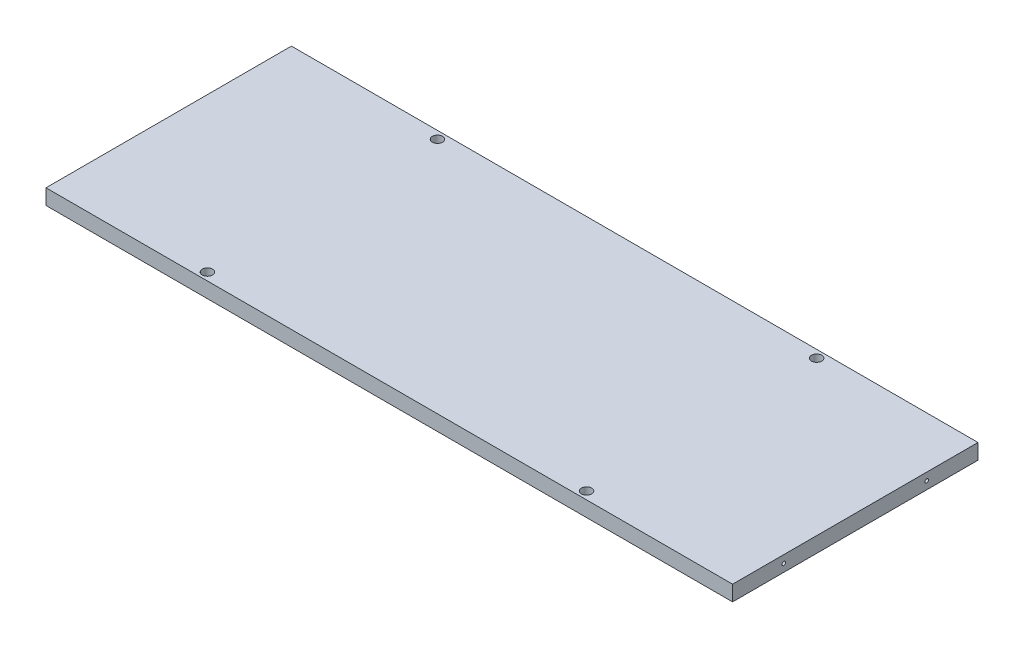
ISO-10303-21;
HEADER;
FILE_DESCRIPTION(('STEP AP214'),'2;1');
FILE_NAME('part.step','',(''),(''),'','','');
FILE_SCHEMA(('AUTOMOTIVE_DESIGN { 1 0 10303 214 1 1 1 1 }'));
ENDSEC;
DATA;
#1=APPLICATION_CONTEXT('core data for automotive mechanical design processes');
#2=APPLICATION_PROTOCOL_DEFINITION('international standard','automotive_design',2000,#1);
#3=PRODUCT_CONTEXT('',#1,'mechanical');
#4=PRODUCT('Part','Part','',(#3));
#5=PRODUCT_RELATED_PRODUCT_CATEGORY('part','',(#4));
#6=PRODUCT_DEFINITION_FORMATION('','',#4);
#7=PRODUCT_DEFINITION_CONTEXT('part definition',#1,'design');
#8=PRODUCT_DEFINITION('design','',#6,#7);
#9=PRODUCT_DEFINITION_SHAPE('','',#8);
#10=(LENGTH_UNIT() NAMED_UNIT(*) SI_UNIT(.MILLI.,.METRE.));
#11=(NAMED_UNIT(*) PLANE_ANGLE_UNIT() SI_UNIT($,.RADIAN.));
#12=(NAMED_UNIT(*) SI_UNIT($,.STERADIAN.) SOLID_ANGLE_UNIT());
#13=UNCERTAINTY_MEASURE_WITH_UNIT(LENGTH_MEASURE(1.E-05),#10,'distance_accuracy_value','');
#14=(GEOMETRIC_REPRESENTATION_CONTEXT(3) GLOBAL_UNCERTAINTY_ASSIGNED_CONTEXT((#13)) GLOBAL_UNIT_ASSIGNED_CONTEXT((#10,
#11,#12)) REPRESENTATION_CONTEXT('',''));
#15=CARTESIAN_POINT('',(0.,0.,0.));
#16=DIRECTION('',(0.,0.,1.));
#17=DIRECTION('',(1.,0.,0.));
#18=AXIS2_PLACEMENT_3D('',#15,#16,#17);
#19=CARTESIAN_POINT('',(37.,-1.50000000000001,46.4));
#20=DIRECTION('',(0.,1.,0.));
#21=DIRECTION('',(0.,0.,1.));
#22=AXIS2_PLACEMENT_3D('',#19,#20,#21);
#23=CYLINDRICAL_SURFACE('',#22,0.700000000000001);
#24=CARTESIAN_POINT('',(37.,-1.50000000000001,46.4));
#25=DIRECTION('',(0.,1.,0.));
#26=DIRECTION('',(0.,0.,1.));
#27=AXIS2_PLACEMENT_3D('',#24,#25,#26);
#28=CIRCLE('',#27,0.700000000000001);
#29=CARTESIAN_POINT('',(37.,-1.50000000000001,47.1));
#30=VERTEX_POINT('',#29);
#31=EDGE_CURVE('E109',#30,#30,#28,.T.);
#32=CARTESIAN_POINT('',(37.,0.,46.4));
#33=DIRECTION('',(0.,1.,0.));
#34=DIRECTION('',(0.,0.,1.));
#35=AXIS2_PLACEMENT_3D('',#32,#33,#34);
#36=CIRCLE('',#35,0.700000000000001);
#37=CARTESIAN_POINT('',(37.,0.,47.1));
#38=VERTEX_POINT('',#37);
#39=EDGE_CURVE('E43',#38,#38,#36,.F.);
#40=CARTESIAN_POINT('',(37.,-1.50000000000001,47.1));
#41=CARTESIAN_POINT('',(37.,-1.48437500000001,47.1));
#42=CARTESIAN_POINT('',(37.,-1.46875000000001,47.1));
#43=CARTESIAN_POINT('',(37.,-1.43750000000001,47.1));
#44=CARTESIAN_POINT('',(37.,-1.42187500000001,47.1));
#45=CARTESIAN_POINT('',(37.,-1.39062500000001,47.1));
#46=CARTESIAN_POINT('',(37.,-1.37500000000001,47.1));
#47=CARTESIAN_POINT('',(37.,-1.34375000000001,47.1));
#48=CARTESIAN_POINT('',(37.,-1.32812500000001,47.1));
#49=CARTESIAN_POINT('',(37.,-1.29687500000001,47.1));
#50=CARTESIAN_POINT('',(37.,-1.28125000000001,47.1));
#51=CARTESIAN_POINT('',(37.,-1.25000000000001,47.1));
#52=CARTESIAN_POINT('',(37.,-1.23437500000001,47.1));
#53=CARTESIAN_POINT('',(37.,-1.20312500000001,47.1));
#54=CARTESIAN_POINT('',(37.,-1.18750000000001,47.1));
#55=CARTESIAN_POINT('',(37.,-1.15625000000001,47.1));
#56=CARTESIAN_POINT('',(37.,-1.14062500000001,47.1));
#57=CARTESIAN_POINT('',(37.,-1.10937500000001,47.1));
#58=CARTESIAN_POINT('',(37.,-1.09375000000001,47.1));
#59=CARTESIAN_POINT('',(37.,-1.06250000000001,47.1));
#60=CARTESIAN_POINT('',(37.,-1.04687500000001,47.1));
#61=CARTESIAN_POINT('',(37.,-1.01562500000001,47.1));
#62=CARTESIAN_POINT('',(37.,-1.00000000000001,47.1));
#63=CARTESIAN_POINT('',(37.,-0.968750000000004,47.1));
#64=CARTESIAN_POINT('',(37.,-0.953125000000004,47.1));
#65=CARTESIAN_POINT('',(37.,-0.921875000000004,47.1));
#66=CARTESIAN_POINT('',(37.,-0.906250000000003,47.1));
#67=CARTESIAN_POINT('',(37.,-0.875000000000003,47.1));
#68=CARTESIAN_POINT('',(37.,-0.859375000000002,47.1));
#69=CARTESIAN_POINT('',(37.,-0.828125000000002,47.1));
#70=CARTESIAN_POINT('',(37.,-0.812500000000001,47.1));
#71=CARTESIAN_POINT('',(37.,-0.781250000000001,47.1));
#72=CARTESIAN_POINT('',(37.,-0.765625000000001,47.1));
#73=CARTESIAN_POINT('',(37.,-0.734375,47.1));
#74=CARTESIAN_POINT('',(37.,-0.71875,47.1));
#75=CARTESIAN_POINT('',(37.,-0.687499999999999,47.1));
#76=CARTESIAN_POINT('',(37.,-0.671874999999999,47.1));
#77=CARTESIAN_POINT('',(37.,-0.640624999999998,47.1));
#78=CARTESIAN_POINT('',(37.,-0.624999999999998,47.1));
#79=CARTESIAN_POINT('',(37.,-0.593749999999997,47.1));
#80=CARTESIAN_POINT('',(37.,-0.578124999999997,47.1));
#81=CARTESIAN_POINT('',(37.,-0.546874999999996,47.1));
#82=CARTESIAN_POINT('',(37.,-0.531249999999996,47.1));
#83=CARTESIAN_POINT('',(37.,-0.499999999999995,47.1));
#84=CARTESIAN_POINT('',(37.,-0.484374999999995,47.1));
#85=CARTESIAN_POINT('',(37.,-0.453124999999995,47.1));
#86=CARTESIAN_POINT('',(37.,-0.437499999999994,47.1));
#87=CARTESIAN_POINT('',(37.,-0.406249999999994,47.1));
#88=CARTESIAN_POINT('',(37.,-0.390624999999993,47.1));
#89=CARTESIAN_POINT('',(37.,-0.359374999999993,47.1));
#90=CARTESIAN_POINT('',(37.,-0.343749999999992,47.1));
#91=CARTESIAN_POINT('',(37.,-0.312499999999992,47.1));
#92=CARTESIAN_POINT('',(37.,-0.296874999999991,47.1));
#93=CARTESIAN_POINT('',(37.,-0.265624999999991,47.1));
#94=CARTESIAN_POINT('',(37.,-0.249999999999991,47.1));
#95=CARTESIAN_POINT('',(37.,-0.21874999999999,47.1));
#96=CARTESIAN_POINT('',(37.,-0.20312499999999,47.1));
#97=CARTESIAN_POINT('',(37.,-0.171874999999989,47.1));
#98=CARTESIAN_POINT('',(37.,-0.156249999999989,47.1));
#99=CARTESIAN_POINT('',(37.,-0.124999999999988,47.1));
#100=CARTESIAN_POINT('',(37.,-0.109374999999988,47.1));
#101=CARTESIAN_POINT('',(37.,-0.0781249999999872,47.1));
#102=CARTESIAN_POINT('',(37.,-0.0624999999999869,47.1));
#103=CARTESIAN_POINT('',(37.,-0.0312499999999863,47.1));
#104=CARTESIAN_POINT('',(37.,-0.015624999999986,47.1));
#105=CARTESIAN_POINT('',(37.,0.,47.1));
#106=B_SPLINE_CURVE_WITH_KNOTS('',3,(#40,#41,#42,#43,#44,#45,#46,#47,#48,#49,#50,#51,#52,#53,
#54,#55,#56,#57,#58,#59,#60,#61,#62,#63,#64,#65,#66,#67,#68,#69,#70,#71,#72,#73,#74,#75,#76,#77,
#78,#79,#80,#81,#82,#83,#84,#85,#86,#87,#88,#89,#90,#91,#92,#93,#94,#95,#96,#97,#98,#99,#100,
#101,#102,#103,#104,#105),.UNSPECIFIED.,.F.,.F.,(4,2,2,2,2,2,2,2,2,2,2,2,2,2,2,2,2,2,2,2,2,2,2,
2,2,2,2,2,2,2,2,2,4),(0.,0.0468750000000007,0.0937500000000016,0.140625000000002,
0.187500000000003,0.234375000000004,0.281250000000005,0.328125000000006,0.375000000000007,
0.421875000000008,0.468750000000009,0.51562500000001,0.562500000000011,0.609375000000012,
0.656250000000013,0.703125000000013,0.750000000000014,0.796875000000015,0.843750000000016,
0.890625000000017,0.937500000000018,0.984375000000019,1.03125000000002,1.07812500000002,
1.12500000000002,1.17187500000002,1.21875000000002,1.26562500000002,1.31250000000003,
1.35937500000003,1.40625000000003,1.45312500000003,1.50000000000003),.UNSPECIFIED.);
#107=EDGE_CURVE('BSEAM39',#30,#38,#106,.T.);
#108=ORIENTED_EDGE('',*,*,#31,.F.);
#109=ORIENTED_EDGE('',*,*,#39,.F.);
#110=ORIENTED_EDGE('',*,*,#107,.T.);
#111=ORIENTED_EDGE('',*,*,#107,.F.);
#112=EDGE_LOOP('',(#108,#110,#109,#111));
#113=FACE_BOUND('',#112,.T.);
#114=ADVANCED_FACE('F39',(#113),#23,.F.);
#115=CARTESIAN_POINT('',(-37.,-1.50000000000001,46.4));
#116=DIRECTION('',(0.,1.,0.));
#117=DIRECTION('',(0.,0.,1.));
#118=AXIS2_PLACEMENT_3D('',#115,#116,#117);
#119=CYLINDRICAL_SURFACE('',#118,0.700000000000001);
#120=CARTESIAN_POINT('',(-37.,-1.50000000000001,46.4));
#121=DIRECTION('',(0.,1.,0.));
#122=DIRECTION('',(0.,0.,1.));
#123=AXIS2_PLACEMENT_3D('',#120,#121,#122);
#124=CIRCLE('',#123,0.700000000000001);
#125=CARTESIAN_POINT('',(-37.,-1.50000000000001,47.1));
#126=VERTEX_POINT('',#125);
#127=EDGE_CURVE('E135',#126,#126,#124,.T.);
#128=CARTESIAN_POINT('',(-37.,0.,46.4));
#129=DIRECTION('',(0.,1.,0.));
#130=DIRECTION('',(0.,0.,1.));
#131=AXIS2_PLACEMENT_3D('',#128,#129,#130);
#132=CIRCLE('',#131,0.700000000000001);
#133=CARTESIAN_POINT('',(-37.,0.,47.1));
#134=VERTEX_POINT('',#133);
#135=EDGE_CURVE('E121',#134,#134,#132,.F.);
#136=CARTESIAN_POINT('',(-37.,-1.50000000000001,47.1));
#137=CARTESIAN_POINT('',(-37.,-1.48437500000001,47.1));
#138=CARTESIAN_POINT('',(-37.,-1.46875000000001,47.1));
#139=CARTESIAN_POINT('',(-37.,-1.43750000000001,47.1));
#140=CARTESIAN_POINT('',(-37.,-1.42187500000001,47.1));
#141=CARTESIAN_POINT('',(-37.,-1.39062500000001,47.1));
#142=CARTESIAN_POINT('',(-37.,-1.37500000000001,47.1));
#143=CARTESIAN_POINT('',(-37.,-1.34375000000001,47.1));
#144=CARTESIAN_POINT('',(-37.,-1.32812500000001,47.1));
#145=CARTESIAN_POINT('',(-37.,-1.29687500000001,47.1));
#146=CARTESIAN_POINT('',(-37.,-1.28125000000001,47.1));
#147=CARTESIAN_POINT('',(-37.,-1.25000000000001,47.1));
#148=CARTESIAN_POINT('',(-37.,-1.23437500000001,47.1));
#149=CARTESIAN_POINT('',(-37.,-1.20312500000001,47.1));
#150=CARTESIAN_POINT('',(-37.,-1.18750000000001,47.1));
#151=CARTESIAN_POINT('',(-37.,-1.15625000000001,47.1));
#152=CARTESIAN_POINT('',(-37.,-1.14062500000001,47.1));
#153=CARTESIAN_POINT('',(-37.,-1.10937500000001,47.1));
#154=CARTESIAN_POINT('',(-37.,-1.09375000000001,47.1));
#155=CARTESIAN_POINT('',(-37.,-1.06250000000001,47.1));
#156=CARTESIAN_POINT('',(-37.,-1.04687500000001,47.1));
#157=CARTESIAN_POINT('',(-37.,-1.01562500000001,47.1));
#158=CARTESIAN_POINT('',(-37.,-1.00000000000001,47.1));
#159=CARTESIAN_POINT('',(-37.,-0.968750000000004,47.1));
#160=CARTESIAN_POINT('',(-37.,-0.953125000000004,47.1));
#161=CARTESIAN_POINT('',(-37.,-0.921875000000004,47.1));
#162=CARTESIAN_POINT('',(-37.,-0.906250000000003,47.1));
#163=CARTESIAN_POINT('',(-37.,-0.875000000000003,47.1));
#164=CARTESIAN_POINT('',(-37.,-0.859375000000002,47.1));
#165=CARTESIAN_POINT('',(-37.,-0.828125000000002,47.1));
#166=CARTESIAN_POINT('',(-37.,-0.812500000000001,47.1));
#167=CARTESIAN_POINT('',(-37.,-0.781250000000001,47.1));
#168=CARTESIAN_POINT('',(-37.,-0.765625000000001,47.1));
#169=CARTESIAN_POINT('',(-37.,-0.734375,47.1));
#170=CARTESIAN_POINT('',(-37.,-0.71875,47.1));
#171=CARTESIAN_POINT('',(-37.,-0.687499999999999,47.1));
#172=CARTESIAN_POINT('',(-37.,-0.671874999999999,47.1));
#173=CARTESIAN_POINT('',(-37.,-0.640624999999998,47.1));
#174=CARTESIAN_POINT('',(-37.,-0.624999999999998,47.1));
#175=CARTESIAN_POINT('',(-37.,-0.593749999999997,47.1));
#176=CARTESIAN_POINT('',(-37.,-0.578124999999997,47.1));
#177=CARTESIAN_POINT('',(-37.,-0.546874999999996,47.1));
#178=CARTESIAN_POINT('',(-37.,-0.531249999999996,47.1));
#179=CARTESIAN_POINT('',(-37.,-0.499999999999995,47.1));
#180=CARTESIAN_POINT('',(-37.,-0.484374999999995,47.1));
#181=CARTESIAN_POINT('',(-37.,-0.453124999999995,47.1));
#182=CARTESIAN_POINT('',(-37.,-0.437499999999994,47.1));
#183=CARTESIAN_POINT('',(-37.,-0.406249999999994,47.1));
#184=CARTESIAN_POINT('',(-37.,-0.390624999999993,47.1));
#185=CARTESIAN_POINT('',(-37.,-0.359374999999993,47.1));
#186=CARTESIAN_POINT('',(-37.,-0.343749999999992,47.1));
#187=CARTESIAN_POINT('',(-37.,-0.312499999999992,47.1));
#188=CARTESIAN_POINT('',(-37.,-0.296874999999991,47.1));
#189=CARTESIAN_POINT('',(-37.,-0.265624999999991,47.1));
#190=CARTESIAN_POINT('',(-37.,-0.249999999999991,47.1));
#191=CARTESIAN_POINT('',(-37.,-0.21874999999999,47.1));
#192=CARTESIAN_POINT('',(-37.,-0.20312499999999,47.1));
#193=CARTESIAN_POINT('',(-37.,-0.171874999999989,47.1));
#194=CARTESIAN_POINT('',(-37.,-0.156249999999989,47.1));
#195=CARTESIAN_POINT('',(-37.,-0.124999999999988,47.1));
#196=CARTESIAN_POINT('',(-37.,-0.109374999999988,47.1));
#197=CARTESIAN_POINT('',(-37.,-0.0781249999999872,47.1));
#198=CARTESIAN_POINT('',(-37.,-0.0624999999999869,47.1));
#199=CARTESIAN_POINT('',(-37.,-0.0312499999999863,47.1));
#200=CARTESIAN_POINT('',(-37.,-0.015624999999986,47.1));
#201=CARTESIAN_POINT('',(-37.,0.,47.1));
#202=B_SPLINE_CURVE_WITH_KNOTS('',3,(#136,#137,#138,#139,#140,#141,#142,#143,#144,#145,#146,
#147,#148,#149,#150,#151,#152,#153,#154,#155,#156,#157,#158,#159,#160,#161,#162,#163,#164,#165,
#166,#167,#168,#169,#170,#171,#172,#173,#174,#175,#176,#177,#178,#179,#180,#181,#182,#183,#184,
#185,#186,#187,#188,#189,#190,#191,#192,#193,#194,#195,#196,#197,#198,#199,#200,#201),
.UNSPECIFIED.,.F.,.F.,(4,2,2,2,2,2,2,2,2,2,2,2,2,2,2,2,2,2,2,2,2,2,2,2,2,2,2,2,2,2,2,2,4),(0.,
0.0468750000000007,0.0937500000000016,0.140625000000002,0.187500000000003,0.234375000000004,
0.281250000000005,0.328125000000006,0.375000000000007,0.421875000000008,0.468750000000009,
0.51562500000001,0.562500000000011,0.609375000000012,0.656250000000013,0.703125000000013,
0.750000000000014,0.796875000000015,0.843750000000016,0.890625000000017,0.937500000000018,
0.984375000000019,1.03125000000002,1.07812500000002,1.12500000000002,1.17187500000002,
1.21875000000002,1.26562500000002,1.31250000000003,1.35937500000003,1.40625000000003,
1.45312500000003,1.50000000000003),.UNSPECIFIED.);
#203=EDGE_CURVE('BSEAM218',#126,#134,#202,.T.);
#204=ORIENTED_EDGE('',*,*,#127,.F.);
#205=ORIENTED_EDGE('',*,*,#135,.F.);
#206=ORIENTED_EDGE('',*,*,#203,.T.);
#207=ORIENTED_EDGE('',*,*,#203,.F.);
#208=EDGE_LOOP('',(#204,#206,#205,#207));
#209=FACE_BOUND('',#208,.T.);
#210=ADVANCED_FACE('F218',(#209),#119,.F.);
#211=CARTESIAN_POINT('',(-37.,-1.50000000000001,1.5));
#212=DIRECTION('',(0.,1.,0.));
#213=DIRECTION('',(0.,0.,1.));
#214=AXIS2_PLACEMENT_3D('',#211,#212,#213);
#215=CYLINDRICAL_SURFACE('',#214,0.700000000000001);
#216=CARTESIAN_POINT('',(-37.,-1.50000000000001,1.5));
#217=DIRECTION('',(0.,1.,0.));
#218=DIRECTION('',(0.,0.,1.));
#219=AXIS2_PLACEMENT_3D('',#216,#217,#218);
#220=CIRCLE('',#219,0.700000000000001);
#221=CARTESIAN_POINT('',(-37.,-1.50000000000001,2.2));
#222=VERTEX_POINT('',#221);
#223=EDGE_CURVE('E130',#222,#222,#220,.T.);
#224=CARTESIAN_POINT('',(-37.,0.,1.5));
#225=DIRECTION('',(0.,1.,0.));
#226=DIRECTION('',(0.,0.,1.));
#227=AXIS2_PLACEMENT_3D('',#224,#225,#226);
#228=CIRCLE('',#227,0.700000000000001);
#229=CARTESIAN_POINT('',(-37.,0.,2.2));
#230=VERTEX_POINT('',#229);
#231=EDGE_CURVE('E118',#230,#230,#228,.F.);
#232=CARTESIAN_POINT('',(-37.,-1.50000000000001,2.2));
#233=CARTESIAN_POINT('',(-37.,-1.48437500000001,2.2));
#234=CARTESIAN_POINT('',(-37.,-1.46875000000001,2.2));
#235=CARTESIAN_POINT('',(-37.,-1.43750000000001,2.2));
#236=CARTESIAN_POINT('',(-37.,-1.42187500000001,2.2));
#237=CARTESIAN_POINT('',(-37.,-1.39062500000001,2.2));
#238=CARTESIAN_POINT('',(-37.,-1.37500000000001,2.2));
#239=CARTESIAN_POINT('',(-37.,-1.34375000000001,2.2));
#240=CARTESIAN_POINT('',(-37.,-1.32812500000001,2.2));
#241=CARTESIAN_POINT('',(-37.,-1.29687500000001,2.2));
#242=CARTESIAN_POINT('',(-37.,-1.28125000000001,2.2));
#243=CARTESIAN_POINT('',(-37.,-1.25000000000001,2.2));
#244=CARTESIAN_POINT('',(-37.,-1.23437500000001,2.2));
#245=CARTESIAN_POINT('',(-37.,-1.20312500000001,2.2));
#246=CARTESIAN_POINT('',(-37.,-1.18750000000001,2.2));
#247=CARTESIAN_POINT('',(-37.,-1.15625000000001,2.2));
#248=CARTESIAN_POINT('',(-37.,-1.14062500000001,2.2));
#249=CARTESIAN_POINT('',(-37.,-1.10937500000001,2.2));
#250=CARTESIAN_POINT('',(-37.,-1.09375000000001,2.2));
#251=CARTESIAN_POINT('',(-37.,-1.06250000000001,2.2));
#252=CARTESIAN_POINT('',(-37.,-1.04687500000001,2.2));
#253=CARTESIAN_POINT('',(-37.,-1.01562500000001,2.2));
#254=CARTESIAN_POINT('',(-37.,-1.00000000000001,2.2));
#255=CARTESIAN_POINT('',(-37.,-0.968750000000004,2.2));
#256=CARTESIAN_POINT('',(-37.,-0.953125000000004,2.2));
#257=CARTESIAN_POINT('',(-37.,-0.921875000000004,2.2));
#258=CARTESIAN_POINT('',(-37.,-0.906250000000003,2.2));
#259=CARTESIAN_POINT('',(-37.,-0.875000000000003,2.2));
#260=CARTESIAN_POINT('',(-37.,-0.859375000000002,2.2));
#261=CARTESIAN_POINT('',(-37.,-0.828125000000002,2.2));
#262=CARTESIAN_POINT('',(-37.,-0.812500000000001,2.2));
#263=CARTESIAN_POINT('',(-37.,-0.781250000000001,2.2));
#264=CARTESIAN_POINT('',(-37.,-0.765625000000001,2.2));
#265=CARTESIAN_POINT('',(-37.,-0.734375,2.2));
#266=CARTESIAN_POINT('',(-37.,-0.71875,2.2));
#267=CARTESIAN_POINT('',(-37.,-0.687499999999999,2.2));
#268=CARTESIAN_POINT('',(-37.,-0.671874999999999,2.2));
#269=CARTESIAN_POINT('',(-37.,-0.640624999999998,2.2));
#270=CARTESIAN_POINT('',(-37.,-0.624999999999998,2.2));
#271=CARTESIAN_POINT('',(-37.,-0.593749999999997,2.2));
#272=CARTESIAN_POINT('',(-37.,-0.578124999999997,2.2));
#273=CARTESIAN_POINT('',(-37.,-0.546874999999996,2.2));
#274=CARTESIAN_POINT('',(-37.,-0.531249999999996,2.2));
#275=CARTESIAN_POINT('',(-37.,-0.499999999999995,2.2));
#276=CARTESIAN_POINT('',(-37.,-0.484374999999995,2.2));
#277=CARTESIAN_POINT('',(-37.,-0.453124999999995,2.2));
#278=CARTESIAN_POINT('',(-37.,-0.437499999999994,2.2));
#279=CARTESIAN_POINT('',(-37.,-0.406249999999994,2.2));
#280=CARTESIAN_POINT('',(-37.,-0.390624999999993,2.2));
#281=CARTESIAN_POINT('',(-37.,-0.359374999999993,2.2));
#282=CARTESIAN_POINT('',(-37.,-0.343749999999992,2.2));
#283=CARTESIAN_POINT('',(-37.,-0.312499999999992,2.2));
#284=CARTESIAN_POINT('',(-37.,-0.296874999999991,2.2));
#285=CARTESIAN_POINT('',(-37.,-0.265624999999991,2.2));
#286=CARTESIAN_POINT('',(-37.,-0.249999999999991,2.2));
#287=CARTESIAN_POINT('',(-37.,-0.21874999999999,2.2));
#288=CARTESIAN_POINT('',(-37.,-0.20312499999999,2.2));
#289=CARTESIAN_POINT('',(-37.,-0.171874999999989,2.2));
#290=CARTESIAN_POINT('',(-37.,-0.156249999999989,2.2));
#291=CARTESIAN_POINT('',(-37.,-0.124999999999988,2.2));
#292=CARTESIAN_POINT('',(-37.,-0.109374999999988,2.2));
#293=CARTESIAN_POINT('',(-37.,-0.0781249999999872,2.2));
#294=CARTESIAN_POINT('',(-37.,-0.0624999999999869,2.2));
#295=CARTESIAN_POINT('',(-37.,-0.0312499999999863,2.2));
#296=CARTESIAN_POINT('',(-37.,-0.015624999999986,2.2));
#297=CARTESIAN_POINT('',(-37.,0.,2.2));
#298=B_SPLINE_CURVE_WITH_KNOTS('',3,(#232,#233,#234,#235,#236,#237,#238,#239,#240,#241,#242,
#243,#244,#245,#246,#247,#248,#249,#250,#251,#252,#253,#254,#255,#256,#257,#258,#259,#260,#261,
#262,#263,#264,#265,#266,#267,#268,#269,#270,#271,#272,#273,#274,#275,#276,#277,#278,#279,#280,
#281,#282,#283,#284,#285,#286,#287,#288,#289,#290,#291,#292,#293,#294,#295,#296,#297),
.UNSPECIFIED.,.F.,.F.,(4,2,2,2,2,2,2,2,2,2,2,2,2,2,2,2,2,2,2,2,2,2,2,2,2,2,2,2,2,2,2,2,4),(0.,
0.0468750000000007,0.0937500000000016,0.140625000000002,0.187500000000003,0.234375000000004,
0.281250000000005,0.328125000000006,0.375000000000007,0.421875000000008,0.468750000000009,
0.51562500000001,0.562500000000011,0.609375000000012,0.656250000000013,0.703125000000013,
0.750000000000014,0.796875000000015,0.843750000000016,0.890625000000017,0.937500000000018,
0.984375000000019,1.03125000000002,1.07812500000002,1.12500000000002,1.17187500000002,
1.21875000000002,1.26562500000002,1.31250000000003,1.35937500000003,1.40625000000003,
1.45312500000003,1.50000000000003),.UNSPECIFIED.);
#299=EDGE_CURVE('BSEAM224',#222,#230,#298,.T.);
#300=ORIENTED_EDGE('',*,*,#223,.F.);
#301=ORIENTED_EDGE('',*,*,#231,.F.);
#302=ORIENTED_EDGE('',*,*,#299,.T.);
#303=ORIENTED_EDGE('',*,*,#299,.F.);
#304=EDGE_LOOP('',(#300,#302,#301,#303));
#305=FACE_BOUND('',#304,.T.);
#306=ADVANCED_FACE('F224',(#305),#215,.F.);
#307=CARTESIAN_POINT('',(37.,-1.50000000000001,1.5));
#308=DIRECTION('',(0.,1.,0.));
#309=DIRECTION('',(0.,0.,1.));
#310=AXIS2_PLACEMENT_3D('',#307,#308,#309);
#311=CYLINDRICAL_SURFACE('',#310,0.700000000000001);
#312=CARTESIAN_POINT('',(37.,-1.50000000000001,1.5));
#313=DIRECTION('',(0.,1.,0.));
#314=DIRECTION('',(0.,0.,1.));
#315=AXIS2_PLACEMENT_3D('',#312,#313,#314);
#316=CIRCLE('',#315,0.700000000000001);
#317=CARTESIAN_POINT('',(37.,-1.50000000000001,2.2));
#318=VERTEX_POINT('',#317);
#319=EDGE_CURVE('E126',#318,#318,#316,.T.);
#320=CARTESIAN_POINT('',(37.,0.,1.5));
#321=DIRECTION('',(0.,1.,0.));
#322=DIRECTION('',(0.,0.,1.));
#323=AXIS2_PLACEMENT_3D('',#320,#321,#322);
#324=CIRCLE('',#323,0.700000000000001);
#325=CARTESIAN_POINT('',(37.,0.,2.2));
#326=VERTEX_POINT('',#325);
#327=EDGE_CURVE('E115',#326,#326,#324,.F.);
#328=CARTESIAN_POINT('',(37.,-1.50000000000001,2.2));
#329=CARTESIAN_POINT('',(37.,-1.48437500000001,2.2));
#330=CARTESIAN_POINT('',(37.,-1.46875000000001,2.2));
#331=CARTESIAN_POINT('',(37.,-1.43750000000001,2.2));
#332=CARTESIAN_POINT('',(37.,-1.42187500000001,2.2));
#333=CARTESIAN_POINT('',(37.,-1.39062500000001,2.2));
#334=CARTESIAN_POINT('',(37.,-1.37500000000001,2.2));
#335=CARTESIAN_POINT('',(37.,-1.34375000000001,2.2));
#336=CARTESIAN_POINT('',(37.,-1.32812500000001,2.2));
#337=CARTESIAN_POINT('',(37.,-1.29687500000001,2.2));
#338=CARTESIAN_POINT('',(37.,-1.28125000000001,2.2));
#339=CARTESIAN_POINT('',(37.,-1.25000000000001,2.2));
#340=CARTESIAN_POINT('',(37.,-1.23437500000001,2.2));
#341=CARTESIAN_POINT('',(37.,-1.20312500000001,2.2));
#342=CARTESIAN_POINT('',(37.,-1.18750000000001,2.2));
#343=CARTESIAN_POINT('',(37.,-1.15625000000001,2.2));
#344=CARTESIAN_POINT('',(37.,-1.14062500000001,2.2));
#345=CARTESIAN_POINT('',(37.,-1.10937500000001,2.2));
#346=CARTESIAN_POINT('',(37.,-1.09375000000001,2.2));
#347=CARTESIAN_POINT('',(37.,-1.06250000000001,2.2));
#348=CARTESIAN_POINT('',(37.,-1.04687500000001,2.2));
#349=CARTESIAN_POINT('',(37.,-1.01562500000001,2.2));
#350=CARTESIAN_POINT('',(37.,-1.00000000000001,2.2));
#351=CARTESIAN_POINT('',(37.,-0.968750000000004,2.2));
#352=CARTESIAN_POINT('',(37.,-0.953125000000004,2.2));
#353=CARTESIAN_POINT('',(37.,-0.921875000000004,2.2));
#354=CARTESIAN_POINT('',(37.,-0.906250000000003,2.2));
#355=CARTESIAN_POINT('',(37.,-0.875000000000003,2.2));
#356=CARTESIAN_POINT('',(37.,-0.859375000000002,2.2));
#357=CARTESIAN_POINT('',(37.,-0.828125000000002,2.2));
#358=CARTESIAN_POINT('',(37.,-0.812500000000001,2.2));
#359=CARTESIAN_POINT('',(37.,-0.781250000000001,2.2));
#360=CARTESIAN_POINT('',(37.,-0.765625000000001,2.2));
#361=CARTESIAN_POINT('',(37.,-0.734375,2.2));
#362=CARTESIAN_POINT('',(37.,-0.71875,2.2));
#363=CARTESIAN_POINT('',(37.,-0.687499999999999,2.2));
#364=CARTESIAN_POINT('',(37.,-0.671874999999999,2.2));
#365=CARTESIAN_POINT('',(37.,-0.640624999999998,2.2));
#366=CARTESIAN_POINT('',(37.,-0.624999999999998,2.2));
#367=CARTESIAN_POINT('',(37.,-0.593749999999997,2.2));
#368=CARTESIAN_POINT('',(37.,-0.578124999999997,2.2));
#369=CARTESIAN_POINT('',(37.,-0.546874999999996,2.2));
#370=CARTESIAN_POINT('',(37.,-0.531249999999996,2.2));
#371=CARTESIAN_POINT('',(37.,-0.499999999999995,2.2));
#372=CARTESIAN_POINT('',(37.,-0.484374999999995,2.2));
#373=CARTESIAN_POINT('',(37.,-0.453124999999995,2.2));
#374=CARTESIAN_POINT('',(37.,-0.437499999999994,2.2));
#375=CARTESIAN_POINT('',(37.,-0.406249999999994,2.2));
#376=CARTESIAN_POINT('',(37.,-0.390624999999993,2.2));
#377=CARTESIAN_POINT('',(37.,-0.359374999999993,2.2));
#378=CARTESIAN_POINT('',(37.,-0.343749999999992,2.2));
#379=CARTESIAN_POINT('',(37.,-0.312499999999992,2.2));
#380=CARTESIAN_POINT('',(37.,-0.296874999999991,2.2));
#381=CARTESIAN_POINT('',(37.,-0.265624999999991,2.2));
#382=CARTESIAN_POINT('',(37.,-0.249999999999991,2.2));
#383=CARTESIAN_POINT('',(37.,-0.21874999999999,2.2));
#384=CARTESIAN_POINT('',(37.,-0.20312499999999,2.2));
#385=CARTESIAN_POINT('',(37.,-0.171874999999989,2.2));
#386=CARTESIAN_POINT('',(37.,-0.156249999999989,2.2));
#387=CARTESIAN_POINT('',(37.,-0.124999999999988,2.2));
#388=CARTESIAN_POINT('',(37.,-0.109374999999988,2.2));
#389=CARTESIAN_POINT('',(37.,-0.0781249999999872,2.2));
#390=CARTESIAN_POINT('',(37.,-0.0624999999999869,2.2));
#391=CARTESIAN_POINT('',(37.,-0.0312499999999863,2.2));
#392=CARTESIAN_POINT('',(37.,-0.015624999999986,2.2));
#393=CARTESIAN_POINT('',(37.,0.,2.2));
#394=B_SPLINE_CURVE_WITH_KNOTS('',3,(#328,#329,#330,#331,#332,#333,#334,#335,#336,#337,#338,
#339,#340,#341,#342,#343,#344,#345,#346,#347,#348,#349,#350,#351,#352,#353,#354,#355,#356,#357,
#358,#359,#360,#361,#362,#363,#364,#365,#366,#367,#368,#369,#370,#371,#372,#373,#374,#375,#376,
#377,#378,#379,#380,#381,#382,#383,#384,#385,#386,#387,#388,#389,#390,#391,#392,#393),
.UNSPECIFIED.,.F.,.F.,(4,2,2,2,2,2,2,2,2,2,2,2,2,2,2,2,2,2,2,2,2,2,2,2,2,2,2,2,2,2,2,2,4),(0.,
0.0468750000000007,0.0937500000000016,0.140625000000002,0.187500000000003,0.234375000000004,
0.281250000000005,0.328125000000006,0.375000000000007,0.421875000000008,0.468750000000009,
0.51562500000001,0.562500000000011,0.609375000000012,0.656250000000013,0.703125000000013,
0.750000000000014,0.796875000000015,0.843750000000016,0.890625000000017,0.937500000000018,
0.984375000000019,1.03125000000002,1.07812500000002,1.12500000000002,1.17187500000002,
1.21875000000002,1.26562500000002,1.31250000000003,1.35937500000003,1.40625000000003,
1.45312500000003,1.50000000000003),.UNSPECIFIED.);
#395=EDGE_CURVE('BSEAM230',#318,#326,#394,.T.);
#396=ORIENTED_EDGE('',*,*,#319,.F.);
#397=ORIENTED_EDGE('',*,*,#327,.F.);
#398=ORIENTED_EDGE('',*,*,#395,.T.);
#399=ORIENTED_EDGE('',*,*,#395,.F.);
#400=EDGE_LOOP('',(#396,#398,#397,#399));
#401=FACE_BOUND('',#400,.T.);
#402=ADVANCED_FACE('F230',(#401),#311,.F.);
#403=CARTESIAN_POINT('',(-67.,1.50000000000001,47.9));
#404=DIRECTION('',(1.,0.,0.));
#405=DIRECTION('',(0.,0.,-1.));
#406=AXIS2_PLACEMENT_3D('',#403,#404,#405);
#407=PLANE('',#406);
#408=CARTESIAN_POINT('',(-67.,0.,10.));
#409=DIRECTION('',(1.,0.,0.));
#410=DIRECTION('',(0.,0.,-1.));
#411=AXIS2_PLACEMENT_3D('',#408,#409,#410);
#412=CIRCLE('',#411,0.350000000000001);
#413=CARTESIAN_POINT('',(-67.,0.,9.65));
#414=VERTEX_POINT('',#413);
#415=EDGE_CURVE('E200',#414,#414,#412,.T.);
#416=ORIENTED_EDGE('',*,*,#415,.T.);
#417=EDGE_LOOP('',(#416));
#418=FACE_BOUND('',#417,.T.);
#419=CARTESIAN_POINT('',(-67.,0.,37.9));
#420=DIRECTION('',(1.,0.,0.));
#421=DIRECTION('',(0.,0.,-1.));
#422=AXIS2_PLACEMENT_3D('',#419,#420,#421);
#423=CIRCLE('',#422,0.350000000000001);
#424=CARTESIAN_POINT('',(-67.,0.,37.55));
#425=VERTEX_POINT('',#424);
#426=EDGE_CURVE('E197',#425,#425,#423,.T.);
#427=ORIENTED_EDGE('',*,*,#426,.T.);
#428=EDGE_LOOP('',(#427));
#429=FACE_BOUND('',#428,.T.);
#430=DIRECTION('',(0.,-1.,0.));
#431=VECTOR('',#430,1.);
#432=CARTESIAN_POINT('',(-67.,1.50000000000001,0.));
#433=LINE('',#432,#431);
#434=CARTESIAN_POINT('',(-67.,1.50000000000001,0.));
#435=VERTEX_POINT('',#434);
#436=CARTESIAN_POINT('',(-67.,-1.50000000000001,0.));
#437=VERTEX_POINT('',#436);
#438=EDGE_CURVE('E106',#435,#437,#433,.T.);
#439=ORIENTED_EDGE('',*,*,#438,.T.);
#440=DIRECTION('',(0.,0.,-1.));
#441=VECTOR('',#440,1.);
#442=CARTESIAN_POINT('',(-67.,-1.50000000000001,47.9));
#443=LINE('',#442,#441);
#444=CARTESIAN_POINT('',(-67.,-1.50000000000001,47.9));
#445=VERTEX_POINT('',#444);
#446=EDGE_CURVE('E11',#445,#437,#443,.T.);
#447=ORIENTED_EDGE('',*,*,#446,.F.);
#448=DIRECTION('',(0.,-1.,0.));
#449=VECTOR('',#448,1.);
#450=CARTESIAN_POINT('',(-67.,1.50000000000001,47.9));
#451=LINE('',#450,#449);
#452=CARTESIAN_POINT('',(-67.,1.50000000000001,47.9));
#453=VERTEX_POINT('',#452);
#454=EDGE_CURVE('E93',#453,#445,#451,.T.);
#455=ORIENTED_EDGE('',*,*,#454,.F.);
#456=DIRECTION('',(0.,0.,-1.));
#457=VECTOR('',#456,1.);
#458=CARTESIAN_POINT('',(-67.,1.50000000000001,47.9));
#459=LINE('',#458,#457);
#460=EDGE_CURVE('E102',#453,#435,#459,.T.);
#461=ORIENTED_EDGE('',*,*,#460,.T.);
#462=EDGE_LOOP('',(#439,#447,#455,#461));
#463=FACE_BOUND('',#462,.T.);
#464=ADVANCED_FACE('F41',(#418,#429,#463),#407,.F.);
#465=CARTESIAN_POINT('',(-67.,-1.50000000000001,47.9));
#466=DIRECTION('',(0.,1.,0.));
#467=DIRECTION('',(-1.,0.,0.));
#468=AXIS2_PLACEMENT_3D('',#465,#466,#467);
#469=PLANE('',#468);
#470=CARTESIAN_POINT('',(-42.3,-1.50000000000001,22.3499999999739));
#471=DIRECTION('',(0.,-1.,0.));
#472=DIRECTION('',(1.,0.,0.));
#473=AXIS2_PLACEMENT_3D('',#470,#471,#472);
#474=CIRCLE('',#473,0.350000000000001);
#475=CARTESIAN_POINT('',(-41.95,-1.50000000000001,22.3499999999739));
#476=VERTEX_POINT('',#475);
#477=EDGE_CURVE('E177',#476,#476,#474,.T.);
#478=ORIENTED_EDGE('',*,*,#477,.F.);
#479=EDGE_LOOP('',(#478));
#480=FACE_BOUND('',#479,.T.);
#481=CARTESIAN_POINT('',(42.3,-1.49999999999999,22.3499999999732));
#482=DIRECTION('',(0.,-1.,0.));
#483=DIRECTION('',(1.,0.,0.));
#484=AXIS2_PLACEMENT_3D('',#481,#482,#483);
#485=CIRCLE('',#484,0.350000000000001);
#486=CARTESIAN_POINT('',(42.65,-1.49999999999999,22.3499999999732));
#487=VERTEX_POINT('',#486);
#488=EDGE_CURVE('E173',#487,#487,#485,.T.);
#489=ORIENTED_EDGE('',*,*,#488,.F.);
#490=EDGE_LOOP('',(#489));
#491=FACE_BOUND('',#490,.T.);
#492=ORIENTED_EDGE('',*,*,#319,.T.);
#493=EDGE_LOOP('',(#492));
#494=FACE_BOUND('',#493,.T.);
#495=ORIENTED_EDGE('',*,*,#223,.T.);
#496=EDGE_LOOP('',(#495));
#497=FACE_BOUND('',#496,.T.);
#498=ORIENTED_EDGE('',*,*,#127,.T.);
#499=EDGE_LOOP('',(#498));
#500=FACE_BOUND('',#499,.T.);
#501=ORIENTED_EDGE('',*,*,#31,.T.);
#502=EDGE_LOOP('',(#501));
#503=FACE_BOUND('',#502,.T.);
#504=DIRECTION('',(1.,0.,0.));
#505=VECTOR('',#504,1.);
#506=CARTESIAN_POINT('',(-67.,-1.50000000000001,0.));
#507=LINE('',#506,#505);
#508=CARTESIAN_POINT('',(67.,-1.49999999999999,0.));
#509=VERTEX_POINT('',#508);
#510=EDGE_CURVE('E97',#437,#509,#507,.T.);
#511=ORIENTED_EDGE('',*,*,#510,.T.);
#512=DIRECTION('',(0.,0.,-1.));
#513=VECTOR('',#512,1.);
#514=CARTESIAN_POINT('',(67.,-1.49999999999999,47.9));
#515=LINE('',#514,#513);
#516=CARTESIAN_POINT('',(67.,-1.49999999999999,47.9));
#517=VERTEX_POINT('',#516);
#518=EDGE_CURVE('E49',#517,#509,#515,.T.);
#519=ORIENTED_EDGE('',*,*,#518,.F.);
#520=DIRECTION('',(1.,0.,0.));
#521=VECTOR('',#520,1.);
#522=CARTESIAN_POINT('',(-67.,-1.50000000000001,47.9));
#523=LINE('',#522,#521);
#524=EDGE_CURVE('E88',#445,#517,#523,.T.);
#525=ORIENTED_EDGE('',*,*,#524,.F.);
#526=ORIENTED_EDGE('',*,*,#446,.T.);
#527=EDGE_LOOP('',(#511,#519,#525,#526));
#528=FACE_BOUND('',#527,.T.);
#529=ADVANCED_FACE('F96',(#480,#491,#494,#497,#500,#503,#528),#469,.F.);
#530=CARTESIAN_POINT('',(67.,1.50000000000001,47.9));
#531=DIRECTION('',(-1.,0.,0.));
#532=DIRECTION('',(0.,0.,1.));
#533=AXIS2_PLACEMENT_3D('',#530,#531,#532);
#534=PLANE('',#533);
#535=CARTESIAN_POINT('',(67.,0.,37.9));
#536=DIRECTION('',(1.,0.,0.));
#537=DIRECTION('',(0.,0.,-1.));
#538=AXIS2_PLACEMENT_3D('',#535,#536,#537);
#539=CIRCLE('',#538,0.350000000000001);
#540=CARTESIAN_POINT('',(67.,0.,37.55));
#541=VERTEX_POINT('',#540);
#542=EDGE_CURVE('E189',#541,#541,#539,.T.);
#543=ORIENTED_EDGE('',*,*,#542,.F.);
#544=EDGE_LOOP('',(#543));
#545=FACE_BOUND('',#544,.T.);
#546=CARTESIAN_POINT('',(67.,0.,10.));
#547=DIRECTION('',(1.,0.,0.));
#548=DIRECTION('',(0.,0.,-1.));
#549=AXIS2_PLACEMENT_3D('',#546,#547,#548);
#550=CIRCLE('',#549,0.350000000000001);
#551=CARTESIAN_POINT('',(67.,0.,9.65));
#552=VERTEX_POINT('',#551);
#553=EDGE_CURVE('E185',#552,#552,#550,.T.);
#554=ORIENTED_EDGE('',*,*,#553,.F.);
#555=EDGE_LOOP('',(#554));
#556=FACE_BOUND('',#555,.T.);
#557=DIRECTION('',(0.,1.,0.));
#558=VECTOR('',#557,1.);
#559=CARTESIAN_POINT('',(67.,1.50000000000001,0.));
#560=LINE('',#559,#558);
#561=CARTESIAN_POINT('',(67.,1.50000000000001,0.));
#562=VERTEX_POINT('',#561);
#563=EDGE_CURVE('E75',#509,#562,#560,.T.);
#564=ORIENTED_EDGE('',*,*,#563,.T.);
#565=DIRECTION('',(0.,0.,-1.));
#566=VECTOR('',#565,1.);
#567=CARTESIAN_POINT('',(67.,1.50000000000001,47.9));
#568=LINE('',#567,#566);
#569=CARTESIAN_POINT('',(67.,1.50000000000001,47.9));
#570=VERTEX_POINT('',#569);
#571=EDGE_CURVE('E98',#570,#562,#568,.T.);
#572=ORIENTED_EDGE('',*,*,#571,.F.);
#573=DIRECTION('',(0.,1.,0.));
#574=VECTOR('',#573,1.);
#575=CARTESIAN_POINT('',(67.,1.50000000000001,47.9));
#576=LINE('',#575,#574);
#577=EDGE_CURVE('E91',#517,#570,#576,.T.);
#578=ORIENTED_EDGE('',*,*,#577,.F.);
#579=ORIENTED_EDGE('',*,*,#518,.T.);
#580=EDGE_LOOP('',(#564,#572,#578,#579));
#581=FACE_BOUND('',#580,.T.);
#582=ADVANCED_FACE('F100',(#545,#556,#581),#534,.F.);
#583=CARTESIAN_POINT('',(-67.,1.50000000000001,47.9));
#584=DIRECTION('',(0.,-1.,0.));
#585=DIRECTION('',(0.,0.,-1.));
#586=AXIS2_PLACEMENT_3D('',#583,#584,#585);
#587=PLANE('',#586);
#588=CARTESIAN_POINT('',(37.,1.50000000000001,46.4));
#589=DIRECTION('',(0.,1.,0.));
#590=DIRECTION('',(0.,0.,1.));
#591=AXIS2_PLACEMENT_3D('',#588,#589,#590);
#592=CIRCLE('',#591,0.999999999999998);
#593=CARTESIAN_POINT('',(37.,1.50000000000001,47.4));
#594=VERTEX_POINT('',#593);
#595=EDGE_CURVE('E149',#594,#594,#592,.T.);
#596=ORIENTED_EDGE('',*,*,#595,.F.);
#597=EDGE_LOOP('',(#596));
#598=FACE_BOUND('',#597,.T.);
#599=CARTESIAN_POINT('',(-37.,1.50000000000001,1.5));
#600=DIRECTION('',(0.,1.,0.));
#601=DIRECTION('',(0.,0.,1.));
#602=AXIS2_PLACEMENT_3D('',#599,#600,#601);
#603=CIRCLE('',#602,0.999999999999998);
#604=CARTESIAN_POINT('',(-37.,1.50000000000001,2.5));
#605=VERTEX_POINT('',#604);
#606=EDGE_CURVE('E155',#605,#605,#603,.T.);
#607=ORIENTED_EDGE('',*,*,#606,.F.);
#608=EDGE_LOOP('',(#607));
#609=FACE_BOUND('',#608,.T.);
#610=CARTESIAN_POINT('',(37.,1.50000000000001,1.5));
#611=DIRECTION('',(0.,1.,0.));
#612=DIRECTION('',(0.,0.,1.));
#613=AXIS2_PLACEMENT_3D('',#610,#611,#612);
#614=CIRCLE('',#613,0.999999999999998);
#615=CARTESIAN_POINT('',(37.,1.50000000000001,2.5));
#616=VERTEX_POINT('',#615);
#617=EDGE_CURVE('E156',#616,#616,#614,.T.);
#618=ORIENTED_EDGE('',*,*,#617,.F.);
#619=EDGE_LOOP('',(#618));
#620=FACE_BOUND('',#619,.T.);
#621=CARTESIAN_POINT('',(-37.,1.50000000000001,46.4));
#622=DIRECTION('',(0.,1.,0.));
#623=DIRECTION('',(0.,0.,1.));
#624=AXIS2_PLACEMENT_3D('',#621,#622,#623);
#625=CIRCLE('',#624,0.999999999999998);
#626=CARTESIAN_POINT('',(-37.,1.50000000000001,47.4));
#627=VERTEX_POINT('',#626);
#628=EDGE_CURVE('E146',#627,#627,#625,.T.);
#629=ORIENTED_EDGE('',*,*,#628,.F.);
#630=EDGE_LOOP('',(#629));
#631=FACE_BOUND('',#630,.T.);
#632=DIRECTION('',(-1.,0.,0.));
#633=VECTOR('',#632,1.);
#634=CARTESIAN_POINT('',(-67.,1.50000000000001,0.));
#635=LINE('',#634,#633);
#636=EDGE_CURVE('E81',#562,#435,#635,.T.);
#637=ORIENTED_EDGE('',*,*,#636,.T.);
#638=ORIENTED_EDGE('',*,*,#460,.F.);
#639=DIRECTION('',(-1.,0.,0.));
#640=VECTOR('',#639,1.);
#641=CARTESIAN_POINT('',(-67.,1.50000000000001,47.9));
#642=LINE('',#641,#640);
#643=EDGE_CURVE('E58',#570,#453,#642,.T.);
#644=ORIENTED_EDGE('',*,*,#643,.F.);
#645=ORIENTED_EDGE('',*,*,#571,.T.);
#646=EDGE_LOOP('',(#637,#638,#644,#645));
#647=FACE_BOUND('',#646,.T.);
#648=ADVANCED_FACE('F235',(#598,#609,#620,#631,#647),#587,.F.);
#649=CARTESIAN_POINT('',(0.,0.,47.9));
#650=DIRECTION('',(0.,0.,1.));
#651=DIRECTION('',(1.,0.,0.));
#652=AXIS2_PLACEMENT_3D('',#649,#650,#651);
#653=PLANE('',#652);
#654=ORIENTED_EDGE('',*,*,#454,.T.);
#655=ORIENTED_EDGE('',*,*,#524,.T.);
#656=ORIENTED_EDGE('',*,*,#577,.T.);
#657=ORIENTED_EDGE('',*,*,#643,.T.);
#658=EDGE_LOOP('',(#654,#655,#656,#657));
#659=FACE_BOUND('',#658,.T.);
#660=ADVANCED_FACE('F89',(#659),#653,.T.);
#661=CARTESIAN_POINT('',(0.,0.,0.));
#662=DIRECTION('',(0.,0.,1.));
#663=DIRECTION('',(1.,0.,0.));
#664=AXIS2_PLACEMENT_3D('',#661,#662,#663);
#665=PLANE('',#664);
#666=ORIENTED_EDGE('',*,*,#438,.F.);
#667=ORIENTED_EDGE('',*,*,#636,.F.);
#668=ORIENTED_EDGE('',*,*,#563,.F.);
#669=ORIENTED_EDGE('',*,*,#510,.F.);
#670=EDGE_LOOP('',(#666,#667,#668,#669));
#671=FACE_BOUND('',#670,.T.);
#672=ADVANCED_FACE('F234',(#671),#665,.F.);
#673=CARTESIAN_POINT('',(37.,0.,1.5));
#674=DIRECTION('',(0.,1.,0.));
#675=DIRECTION('',(0.,0.,1.));
#676=AXIS2_PLACEMENT_3D('',#673,#674,#675);
#677=PLANE('',#676);
#678=CARTESIAN_POINT('',(37.,0.,1.5));
#679=DIRECTION('',(0.,1.,0.));
#680=DIRECTION('',(0.,0.,1.));
#681=AXIS2_PLACEMENT_3D('',#678,#679,#680);
#682=CIRCLE('',#681,0.999999999999998);
#683=CARTESIAN_POINT('',(37.,0.,2.5));
#684=VERTEX_POINT('',#683);
#685=EDGE_CURVE('E164',#684,#684,#682,.T.);
#686=ORIENTED_EDGE('',*,*,#685,.T.);
#687=EDGE_LOOP('',(#686));
#688=FACE_BOUND('',#687,.T.);
#689=ORIENTED_EDGE('',*,*,#327,.T.);
#690=EDGE_LOOP('',(#689));
#691=FACE_BOUND('',#690,.T.);
#692=ADVANCED_FACE('F238',(#688,#691),#677,.T.);
#693=CARTESIAN_POINT('',(37.,0.,1.5));
#694=DIRECTION('',(0.,1.,0.));
#695=DIRECTION('',(0.,0.,1.));
#696=AXIS2_PLACEMENT_3D('',#693,#694,#695);
#697=CYLINDRICAL_SURFACE('',#696,0.999999999999998);
#698=ORIENTED_EDGE('',*,*,#685,.F.);
#699=EDGE_LOOP('',(#698));
#700=FACE_BOUND('',#699,.T.);
#701=ORIENTED_EDGE('',*,*,#617,.T.);
#702=EDGE_LOOP('',(#701));
#703=FACE_BOUND('',#702,.T.);
#704=ADVANCED_FACE('F266',(#700,#703),#697,.F.);
#705=CARTESIAN_POINT('',(-37.,0.,1.5));
#706=DIRECTION('',(0.,1.,0.));
#707=DIRECTION('',(0.,0.,1.));
#708=AXIS2_PLACEMENT_3D('',#705,#706,#707);
#709=PLANE('',#708);
#710=CARTESIAN_POINT('',(-37.,0.,1.5));
#711=DIRECTION('',(0.,1.,0.));
#712=DIRECTION('',(0.,0.,1.));
#713=AXIS2_PLACEMENT_3D('',#710,#711,#712);
#714=CIRCLE('',#713,0.999999999999998);
#715=CARTESIAN_POINT('',(-37.,0.,2.5));
#716=VERTEX_POINT('',#715);
#717=EDGE_CURVE('E152',#716,#716,#714,.T.);
#718=ORIENTED_EDGE('',*,*,#717,.T.);
#719=EDGE_LOOP('',(#718));
#720=FACE_BOUND('',#719,.T.);
#721=ORIENTED_EDGE('',*,*,#231,.T.);
#722=EDGE_LOOP('',(#721));
#723=FACE_BOUND('',#722,.T.);
#724=ADVANCED_FACE('F263',(#720,#723),#709,.T.);
#725=CARTESIAN_POINT('',(-37.,0.,1.5));
#726=DIRECTION('',(0.,1.,0.));
#727=DIRECTION('',(0.,0.,1.));
#728=AXIS2_PLACEMENT_3D('',#725,#726,#727);
#729=CYLINDRICAL_SURFACE('',#728,0.999999999999998);
#730=ORIENTED_EDGE('',*,*,#717,.F.);
#731=EDGE_LOOP('',(#730));
#732=FACE_BOUND('',#731,.T.);
#733=ORIENTED_EDGE('',*,*,#606,.T.);
#734=EDGE_LOOP('',(#733));
#735=FACE_BOUND('',#734,.T.);
#736=ADVANCED_FACE('F265',(#732,#735),#729,.F.);
#737=CARTESIAN_POINT('',(-37.,0.,46.4));
#738=DIRECTION('',(0.,1.,0.));
#739=DIRECTION('',(0.,0.,1.));
#740=AXIS2_PLACEMENT_3D('',#737,#738,#739);
#741=PLANE('',#740);
#742=CARTESIAN_POINT('',(-37.,0.,46.4));
#743=DIRECTION('',(0.,1.,0.));
#744=DIRECTION('',(0.,0.,1.));
#745=AXIS2_PLACEMENT_3D('',#742,#743,#744);
#746=CIRCLE('',#745,0.999999999999998);
#747=CARTESIAN_POINT('',(-37.,0.,47.4));
#748=VERTEX_POINT('',#747);
#749=EDGE_CURVE('E119',#748,#748,#746,.T.);
#750=ORIENTED_EDGE('',*,*,#749,.T.);
#751=EDGE_LOOP('',(#750));
#752=FACE_BOUND('',#751,.T.);
#753=ORIENTED_EDGE('',*,*,#135,.T.);
#754=EDGE_LOOP('',(#753));
#755=FACE_BOUND('',#754,.T.);
#756=ADVANCED_FACE('F273',(#752,#755),#741,.T.);
#757=CARTESIAN_POINT('',(-37.,0.,46.4));
#758=DIRECTION('',(0.,1.,0.));
#759=DIRECTION('',(0.,0.,1.));
#760=AXIS2_PLACEMENT_3D('',#757,#758,#759);
#761=CYLINDRICAL_SURFACE('',#760,0.999999999999998);
#762=ORIENTED_EDGE('',*,*,#749,.F.);
#763=EDGE_LOOP('',(#762));
#764=FACE_BOUND('',#763,.T.);
#765=ORIENTED_EDGE('',*,*,#628,.T.);
#766=EDGE_LOOP('',(#765));
#767=FACE_BOUND('',#766,.T.);
#768=ADVANCED_FACE('F282',(#764,#767),#761,.F.);
#769=CARTESIAN_POINT('',(37.,0.,46.4));
#770=DIRECTION('',(0.,1.,0.));
#771=DIRECTION('',(0.,0.,1.));
#772=AXIS2_PLACEMENT_3D('',#769,#770,#771);
#773=PLANE('',#772);
#774=CARTESIAN_POINT('',(37.,0.,46.4));
#775=DIRECTION('',(0.,1.,0.));
#776=DIRECTION('',(0.,0.,1.));
#777=AXIS2_PLACEMENT_3D('',#774,#775,#776);
#778=CIRCLE('',#777,0.999999999999998);
#779=CARTESIAN_POINT('',(37.,0.,47.4));
#780=VERTEX_POINT('',#779);
#781=EDGE_CURVE('E159',#780,#780,#778,.T.);
#782=ORIENTED_EDGE('',*,*,#781,.T.);
#783=EDGE_LOOP('',(#782));
#784=FACE_BOUND('',#783,.T.);
#785=ORIENTED_EDGE('',*,*,#39,.T.);
#786=EDGE_LOOP('',(#785));
#787=FACE_BOUND('',#786,.T.);
#788=ADVANCED_FACE('F285',(#784,#787),#773,.T.);
#789=CARTESIAN_POINT('',(37.,0.,46.4));
#790=DIRECTION('',(0.,1.,0.));
#791=DIRECTION('',(0.,0.,1.));
#792=AXIS2_PLACEMENT_3D('',#789,#790,#791);
#793=CYLINDRICAL_SURFACE('',#792,0.999999999999998);
#794=ORIENTED_EDGE('',*,*,#781,.F.);
#795=EDGE_LOOP('',(#794));
#796=FACE_BOUND('',#795,.T.);
#797=ORIENTED_EDGE('',*,*,#595,.T.);
#798=EDGE_LOOP('',(#797));
#799=FACE_BOUND('',#798,.T.);
#800=ADVANCED_FACE('F290',(#796,#799),#793,.F.);
#801=CARTESIAN_POINT('',(42.3,0.,22.3499999999732));
#802=DIRECTION('',(0.,-1.,0.));
#803=DIRECTION('',(1.,0.,0.));
#804=AXIS2_PLACEMENT_3D('',#801,#802,#803);
#805=CYLINDRICAL_SURFACE('',#804,0.350000000000001);
#806=CARTESIAN_POINT('',(42.3,0.,22.3499999999732));
#807=DIRECTION('',(0.,-1.,0.));
#808=DIRECTION('',(1.,0.,0.));
#809=AXIS2_PLACEMENT_3D('',#806,#807,#808);
#810=CIRCLE('',#809,0.350000000000001);
#811=CARTESIAN_POINT('',(42.65,0.,22.3499999999732));
#812=VERTEX_POINT('',#811);
#813=EDGE_CURVE('E170',#812,#812,#810,.T.);
#814=ORIENTED_EDGE('',*,*,#813,.F.);
#815=EDGE_LOOP('',(#814));
#816=FACE_BOUND('',#815,.T.);
#817=ORIENTED_EDGE('',*,*,#488,.T.);
#818=EDGE_LOOP('',(#817));
#819=FACE_BOUND('',#818,.T.);
#820=ADVANCED_FACE('F299',(#816,#819),#805,.F.);
#821=CARTESIAN_POINT('',(42.3,0.,22.3499999999732));
#822=DIRECTION('',(0.,-1.,0.));
#823=DIRECTION('',(1.,0.,0.));
#824=AXIS2_PLACEMENT_3D('',#821,#822,#823);
#825=PLANE('',#824);
#826=ORIENTED_EDGE('',*,*,#813,.T.);
#827=EDGE_LOOP('',(#826));
#828=FACE_BOUND('',#827,.T.);
#829=ADVANCED_FACE('F306',(#828),#825,.T.);
#830=CARTESIAN_POINT('',(-42.3,0.,22.3499999999739));
#831=DIRECTION('',(0.,-1.,0.));
#832=DIRECTION('',(1.,0.,0.));
#833=AXIS2_PLACEMENT_3D('',#830,#831,#832);
#834=CYLINDRICAL_SURFACE('',#833,0.350000000000001);
#835=CARTESIAN_POINT('',(-42.3,0.,22.3499999999739));
#836=DIRECTION('',(0.,-1.,0.));
#837=DIRECTION('',(1.,0.,0.));
#838=AXIS2_PLACEMENT_3D('',#835,#836,#837);
#839=CIRCLE('',#838,0.350000000000001);
#840=CARTESIAN_POINT('',(-41.95,0.,22.3499999999739));
#841=VERTEX_POINT('',#840);
#842=EDGE_CURVE('E167',#841,#841,#839,.T.);
#843=ORIENTED_EDGE('',*,*,#842,.F.);
#844=EDGE_LOOP('',(#843));
#845=FACE_BOUND('',#844,.T.);
#846=ORIENTED_EDGE('',*,*,#477,.T.);
#847=EDGE_LOOP('',(#846));
#848=FACE_BOUND('',#847,.T.);
#849=ADVANCED_FACE('F309',(#845,#848),#834,.F.);
#850=CARTESIAN_POINT('',(-42.3,0.,22.3499999999739));
#851=DIRECTION('',(0.,-1.,0.));
#852=DIRECTION('',(1.,0.,0.));
#853=AXIS2_PLACEMENT_3D('',#850,#851,#852);
#854=PLANE('',#853);
#855=ORIENTED_EDGE('',*,*,#842,.T.);
#856=EDGE_LOOP('',(#855));
#857=FACE_BOUND('',#856,.T.);
#858=ADVANCED_FACE('F316',(#857),#854,.T.);
#859=CARTESIAN_POINT('',(65.5,0.,10.));
#860=DIRECTION('',(1.,0.,0.));
#861=DIRECTION('',(0.,0.,-1.));
#862=AXIS2_PLACEMENT_3D('',#859,#860,#861);
#863=CYLINDRICAL_SURFACE('',#862,0.350000000000001);
#864=CARTESIAN_POINT('',(65.5,0.,10.));
#865=DIRECTION('',(1.,0.,0.));
#866=DIRECTION('',(0.,0.,-1.));
#867=AXIS2_PLACEMENT_3D('',#864,#865,#866);
#868=CIRCLE('',#867,0.350000000000001);
#869=CARTESIAN_POINT('',(65.5,0.,9.65));
#870=VERTEX_POINT('',#869);
#871=EDGE_CURVE('E182',#870,#870,#868,.T.);
#872=ORIENTED_EDGE('',*,*,#871,.F.);
#873=EDGE_LOOP('',(#872));
#874=FACE_BOUND('',#873,.T.);
#875=ORIENTED_EDGE('',*,*,#553,.T.);
#876=EDGE_LOOP('',(#875));
#877=FACE_BOUND('',#876,.T.);
#878=ADVANCED_FACE('F320',(#874,#877),#863,.F.);
#879=CARTESIAN_POINT('',(65.5,0.,10.));
#880=DIRECTION('',(1.,0.,0.));
#881=DIRECTION('',(0.,0.,-1.));
#882=AXIS2_PLACEMENT_3D('',#879,#880,#881);
#883=PLANE('',#882);
#884=ORIENTED_EDGE('',*,*,#871,.T.);
#885=EDGE_LOOP('',(#884));
#886=FACE_BOUND('',#885,.T.);
#887=ADVANCED_FACE('F322',(#886),#883,.T.);
#888=CARTESIAN_POINT('',(65.5,0.,37.9));
#889=DIRECTION('',(1.,0.,0.));
#890=DIRECTION('',(0.,0.,-1.));
#891=AXIS2_PLACEMENT_3D('',#888,#889,#890);
#892=CYLINDRICAL_SURFACE('',#891,0.350000000000001);
#893=CARTESIAN_POINT('',(65.5,0.,37.9));
#894=DIRECTION('',(1.,0.,0.));
#895=DIRECTION('',(0.,0.,-1.));
#896=AXIS2_PLACEMENT_3D('',#893,#894,#895);
#897=CIRCLE('',#896,0.350000000000001);
#898=CARTESIAN_POINT('',(65.5,0.,37.55));
#899=VERTEX_POINT('',#898);
#900=EDGE_CURVE('E174',#899,#899,#897,.T.);
#901=ORIENTED_EDGE('',*,*,#900,.F.);
#902=EDGE_LOOP('',(#901));
#903=FACE_BOUND('',#902,.T.);
#904=ORIENTED_EDGE('',*,*,#542,.T.);
#905=EDGE_LOOP('',(#904));
#906=FACE_BOUND('',#905,.T.);
#907=ADVANCED_FACE('F325',(#903,#906),#892,.F.);
#908=CARTESIAN_POINT('',(65.5,0.,37.9));
#909=DIRECTION('',(1.,0.,0.));
#910=DIRECTION('',(0.,0.,-1.));
#911=AXIS2_PLACEMENT_3D('',#908,#909,#910);
#912=PLANE('',#911);
#913=ORIENTED_EDGE('',*,*,#900,.T.);
#914=EDGE_LOOP('',(#913));
#915=FACE_BOUND('',#914,.T.);
#916=ADVANCED_FACE('F332',(#915),#912,.T.);
#917=CARTESIAN_POINT('',(-65.5,0.,37.9));
#918=DIRECTION('',(-1.,0.,0.));
#919=DIRECTION('',(0.,0.,1.));
#920=AXIS2_PLACEMENT_3D('',#917,#918,#919);
#921=CYLINDRICAL_SURFACE('',#920,0.350000000000001);
#922=CARTESIAN_POINT('',(-65.5,0.,37.9));
#923=DIRECTION('',(1.,0.,0.));
#924=DIRECTION('',(0.,0.,-1.));
#925=AXIS2_PLACEMENT_3D('',#922,#923,#924);
#926=CIRCLE('',#925,0.350000000000001);
#927=CARTESIAN_POINT('',(-65.5,0.,37.55));
#928=VERTEX_POINT('',#927);
#929=EDGE_CURVE('E194',#928,#928,#926,.T.);
#930=ORIENTED_EDGE('',*,*,#929,.T.);
#931=EDGE_LOOP('',(#930));
#932=FACE_BOUND('',#931,.T.);
#933=ORIENTED_EDGE('',*,*,#426,.F.);
#934=EDGE_LOOP('',(#933));
#935=FACE_BOUND('',#934,.T.);
#936=ADVANCED_FACE('F336',(#932,#935),#921,.F.);
#937=CARTESIAN_POINT('',(-65.5,0.,37.9));
#938=DIRECTION('',(1.,0.,0.));
#939=DIRECTION('',(0.,0.,-1.));
#940=AXIS2_PLACEMENT_3D('',#937,#938,#939);
#941=PLANE('',#940);
#942=ORIENTED_EDGE('',*,*,#929,.F.);
#943=EDGE_LOOP('',(#942));
#944=FACE_BOUND('',#943,.T.);
#945=ADVANCED_FACE('F215',(#944),#941,.F.);
#946=CARTESIAN_POINT('',(-65.5,0.,10.));
#947=DIRECTION('',(-1.,0.,0.));
#948=DIRECTION('',(0.,0.,1.));
#949=AXIS2_PLACEMENT_3D('',#946,#947,#948);
#950=CYLINDRICAL_SURFACE('',#949,0.350000000000001);
#951=CARTESIAN_POINT('',(-65.5,0.,10.));
#952=DIRECTION('',(1.,0.,0.));
#953=DIRECTION('',(0.,0.,-1.));
#954=AXIS2_PLACEMENT_3D('',#951,#952,#953);
#955=CIRCLE('',#954,0.350000000000001);
#956=CARTESIAN_POINT('',(-65.5,0.,9.65));
#957=VERTEX_POINT('',#956);
#958=EDGE_CURVE('E186',#957,#957,#955,.T.);
#959=ORIENTED_EDGE('',*,*,#958,.T.);
#960=EDGE_LOOP('',(#959));
#961=FACE_BOUND('',#960,.T.);
#962=ORIENTED_EDGE('',*,*,#415,.F.);
#963=EDGE_LOOP('',(#962));
#964=FACE_BOUND('',#963,.T.);
#965=ADVANCED_FACE('F206',(#961,#964),#950,.F.);
#966=CARTESIAN_POINT('',(-65.5,0.,10.));
#967=DIRECTION('',(1.,0.,0.));
#968=DIRECTION('',(0.,0.,-1.));
#969=AXIS2_PLACEMENT_3D('',#966,#967,#968);
#970=PLANE('',#969);
#971=ORIENTED_EDGE('',*,*,#958,.F.);
#972=EDGE_LOOP('',(#971));
#973=FACE_BOUND('',#972,.T.);
#974=ADVANCED_FACE('F209',(#973),#970,.F.);
#975=CLOSED_SHELL('',(#114,#210,#306,#402,#464,#529,#582,#648,#660,#672,#692,#704,#724,#736,
#756,#768,#788,#800,#820,#829,#849,#858,#878,#887,#907,#916,#936,#945,#965,#974));
#976=MANIFOLD_SOLID_BREP('B2',#975);
#977=ADVANCED_BREP_SHAPE_REPRESENTATION('',(#18,#976),#14);
#978=SHAPE_DEFINITION_REPRESENTATION(#9,#977);
ENDSEC;
END-ISO-10303-21;
